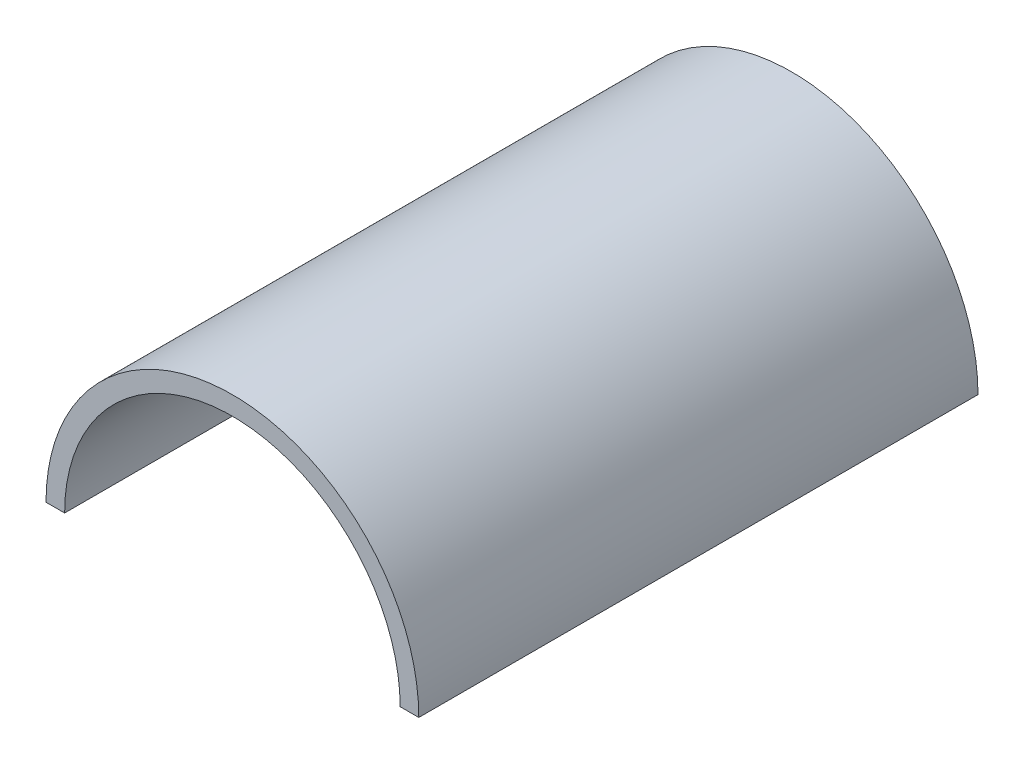
ISO-10303-21;
HEADER;
FILE_DESCRIPTION(('STEP AP214'),'2;1');
FILE_NAME('part.step','',(''),(''),'','','');
FILE_SCHEMA(('AUTOMOTIVE_DESIGN { 1 0 10303 214 1 1 1 1 }'));
ENDSEC;
DATA;
#1=APPLICATION_CONTEXT('core data for automotive mechanical design processes');
#2=APPLICATION_PROTOCOL_DEFINITION('international standard','automotive_design',2000,#1);
#3=PRODUCT_CONTEXT('',#1,'mechanical');
#4=PRODUCT('Part','Part','',(#3));
#5=PRODUCT_RELATED_PRODUCT_CATEGORY('part','',(#4));
#6=PRODUCT_DEFINITION_FORMATION('','',#4);
#7=PRODUCT_DEFINITION_CONTEXT('part definition',#1,'design');
#8=PRODUCT_DEFINITION('design','',#6,#7);
#9=PRODUCT_DEFINITION_SHAPE('','',#8);
#10=(LENGTH_UNIT() NAMED_UNIT(*) SI_UNIT(.MILLI.,.METRE.));
#11=(NAMED_UNIT(*) PLANE_ANGLE_UNIT() SI_UNIT($,.RADIAN.));
#12=(NAMED_UNIT(*) SI_UNIT($,.STERADIAN.) SOLID_ANGLE_UNIT());
#13=UNCERTAINTY_MEASURE_WITH_UNIT(LENGTH_MEASURE(1.E-05),#10,'distance_accuracy_value','');
#14=(GEOMETRIC_REPRESENTATION_CONTEXT(3) GLOBAL_UNCERTAINTY_ASSIGNED_CONTEXT((#13)) GLOBAL_UNIT_ASSIGNED_CONTEXT((#10,
#11,#12)) REPRESENTATION_CONTEXT('',''));
#15=CARTESIAN_POINT('',(0.,0.,0.));
#16=DIRECTION('',(0.,0.,1.));
#17=DIRECTION('',(1.,0.,0.));
#18=AXIS2_PLACEMENT_3D('',#15,#16,#17);
#19=CARTESIAN_POINT('',(0.,0.,60.));
#20=DIRECTION('',(0.,0.,1.));
#21=DIRECTION('',(1.,0.,0.));
#22=AXIS2_PLACEMENT_3D('',#19,#20,#21);
#23=PLANE('',#22);
#24=DIRECTION('',(1.,0.,0.));
#25=VECTOR('',#24,1.);
#26=CARTESIAN_POINT('',(-20.,0.,60.));
#27=LINE('',#26,#25);
#28=CARTESIAN_POINT('',(18.,0.,60.));
#29=VERTEX_POINT('',#28);
#30=CARTESIAN_POINT('',(20.,0.,60.));
#31=VERTEX_POINT('',#30);
#32=EDGE_CURVE('E61',#29,#31,#27,.T.);
#33=ORIENTED_EDGE('',*,*,#32,.T.);
#34=CARTESIAN_POINT('',(0.,0.,60.));
#35=DIRECTION('',(0.,0.,1.));
#36=DIRECTION('',(1.,0.,0.));
#37=AXIS2_PLACEMENT_3D('',#34,#35,#36);
#38=CIRCLE('',#37,20.);
#39=CARTESIAN_POINT('',(-20.,0.,60.));
#40=VERTEX_POINT('',#39);
#41=EDGE_CURVE('E92',#31,#40,#38,.T.);
#42=ORIENTED_EDGE('',*,*,#41,.T.);
#43=CARTESIAN_POINT('',(-18.,0.,60.));
#44=VERTEX_POINT('',#43);
#45=EDGE_CURVE('E77',#40,#44,#27,.T.);
#46=ORIENTED_EDGE('',*,*,#45,.T.);
#47=CARTESIAN_POINT('',(0.,0.,60.));
#48=DIRECTION('',(0.,0.,1.));
#49=DIRECTION('',(1.,0.,0.));
#50=AXIS2_PLACEMENT_3D('',#47,#48,#49);
#51=CIRCLE('',#50,18.);
#52=EDGE_CURVE('E101',#29,#44,#51,.T.);
#53=ORIENTED_EDGE('',*,*,#52,.F.);
#54=EDGE_LOOP('',(#33,#42,#46,#53));
#55=FACE_BOUND('',#54,.T.);
#56=ADVANCED_FACE('F38',(#55),#23,.T.);
#57=CARTESIAN_POINT('',(0.,0.,0.));
#58=DIRECTION('',(0.,0.,1.));
#59=DIRECTION('',(1.,0.,0.));
#60=AXIS2_PLACEMENT_3D('',#57,#58,#59);
#61=PLANE('',#60);
#62=CARTESIAN_POINT('',(0.,0.,0.));
#63=DIRECTION('',(0.,0.,1.));
#64=DIRECTION('',(1.,0.,0.));
#65=AXIS2_PLACEMENT_3D('',#62,#63,#64);
#66=CIRCLE('',#65,20.);
#67=CARTESIAN_POINT('',(20.,0.,0.));
#68=VERTEX_POINT('',#67);
#69=CARTESIAN_POINT('',(-20.,0.,0.));
#70=VERTEX_POINT('',#69);
#71=EDGE_CURVE('E94',#68,#70,#66,.T.);
#72=ORIENTED_EDGE('',*,*,#71,.F.);
#73=DIRECTION('',(-1.,0.,0.));
#74=VECTOR('',#73,1.);
#75=CARTESIAN_POINT('',(-20.,0.,0.));
#76=LINE('',#75,#74);
#77=CARTESIAN_POINT('',(18.,0.,0.));
#78=VERTEX_POINT('',#77);
#79=EDGE_CURVE('E108',#68,#78,#76,.T.);
#80=ORIENTED_EDGE('',*,*,#79,.T.);
#81=CARTESIAN_POINT('',(0.,0.,0.));
#82=DIRECTION('',(0.,0.,1.));
#83=DIRECTION('',(1.,0.,0.));
#84=AXIS2_PLACEMENT_3D('',#81,#82,#83);
#85=CIRCLE('',#84,18.);
#86=CARTESIAN_POINT('',(-18.,0.,0.));
#87=VERTEX_POINT('',#86);
#88=EDGE_CURVE('E104',#78,#87,#85,.T.);
#89=ORIENTED_EDGE('',*,*,#88,.T.);
#90=EDGE_CURVE('E54',#87,#70,#76,.T.);
#91=ORIENTED_EDGE('',*,*,#90,.T.);
#92=EDGE_LOOP('',(#72,#80,#89,#91));
#93=FACE_BOUND('',#92,.T.);
#94=ADVANCED_FACE('F117',(#93),#61,.F.);
#95=CARTESIAN_POINT('',(0.,0.,60.));
#96=DIRECTION('',(0.,0.,-1.));
#97=DIRECTION('',(-1.,0.,0.));
#98=AXIS2_PLACEMENT_3D('',#95,#96,#97);
#99=CYLINDRICAL_SURFACE('',#98,20.);
#100=ORIENTED_EDGE('',*,*,#41,.F.);
#101=DIRECTION('',(0.,0.,-1.));
#102=VECTOR('',#101,1.);
#103=CARTESIAN_POINT('',(20.,0.,0.));
#104=LINE('',#103,#102);
#105=EDGE_CURVE('E86',#31,#68,#104,.T.);
#106=ORIENTED_EDGE('',*,*,#105,.T.);
#107=ORIENTED_EDGE('',*,*,#71,.T.);
#108=DIRECTION('',(0.,0.,1.));
#109=VECTOR('',#108,1.);
#110=CARTESIAN_POINT('',(-20.,0.,0.));
#111=LINE('',#110,#109);
#112=EDGE_CURVE('E80',#70,#40,#111,.T.);
#113=ORIENTED_EDGE('',*,*,#112,.T.);
#114=EDGE_LOOP('',(#100,#106,#107,#113));
#115=FACE_BOUND('',#114,.T.);
#116=ADVANCED_FACE('F40',(#115),#99,.T.);
#117=CARTESIAN_POINT('',(0.,0.,60.));
#118=DIRECTION('',(0.,0.,-1.));
#119=DIRECTION('',(-1.,0.,0.));
#120=AXIS2_PLACEMENT_3D('',#117,#118,#119);
#121=CYLINDRICAL_SURFACE('',#120,18.);
#122=DIRECTION('',(0.,0.,-1.));
#123=VECTOR('',#122,1.);
#124=CARTESIAN_POINT('',(18.,0.,60.));
#125=LINE('',#124,#123);
#126=EDGE_CURVE('E11',#29,#78,#125,.T.);
#127=ORIENTED_EDGE('',*,*,#126,.F.);
#128=ORIENTED_EDGE('',*,*,#52,.T.);
#129=DIRECTION('',(0.,0.,-1.));
#130=VECTOR('',#129,1.);
#131=CARTESIAN_POINT('',(-18.,0.,60.));
#132=LINE('',#131,#130);
#133=EDGE_CURVE('E47',#87,#44,#132,.F.);
#134=ORIENTED_EDGE('',*,*,#133,.F.);
#135=ORIENTED_EDGE('',*,*,#88,.F.);
#136=EDGE_LOOP('',(#127,#128,#134,#135));
#137=FACE_BOUND('',#136,.T.);
#138=ADVANCED_FACE('F120',(#137),#121,.F.);
#139=CARTESIAN_POINT('',(0.,0.,0.));
#140=DIRECTION('',(0.,1.,0.));
#141=DIRECTION('',(0.,0.,1.));
#142=AXIS2_PLACEMENT_3D('',#139,#140,#141);
#143=PLANE('',#142);
#144=ORIENTED_EDGE('',*,*,#133,.T.);
#145=ORIENTED_EDGE('',*,*,#45,.F.);
#146=ORIENTED_EDGE('',*,*,#112,.F.);
#147=ORIENTED_EDGE('',*,*,#90,.F.);
#148=EDGE_LOOP('',(#144,#145,#146,#147));
#149=FACE_BOUND('',#148,.T.);
#150=ADVANCED_FACE('F79',(#149),#143,.F.);
#151=ORIENTED_EDGE('',*,*,#126,.T.);
#152=ORIENTED_EDGE('',*,*,#79,.F.);
#153=ORIENTED_EDGE('',*,*,#105,.F.);
#154=ORIENTED_EDGE('',*,*,#32,.F.);
#155=EDGE_LOOP('',(#151,#152,#153,#154));
#156=FACE_BOUND('',#155,.T.);
#157=ADVANCED_FACE('F121',(#156),#143,.F.);
#158=CLOSED_SHELL('',(#56,#94,#116,#138,#150,#157));
#159=MANIFOLD_SOLID_BREP('B2',#158);
#160=ADVANCED_BREP_SHAPE_REPRESENTATION('',(#18,#159),#14);
#161=SHAPE_DEFINITION_REPRESENTATION(#9,#160);
ENDSEC;
END-ISO-10303-21;
